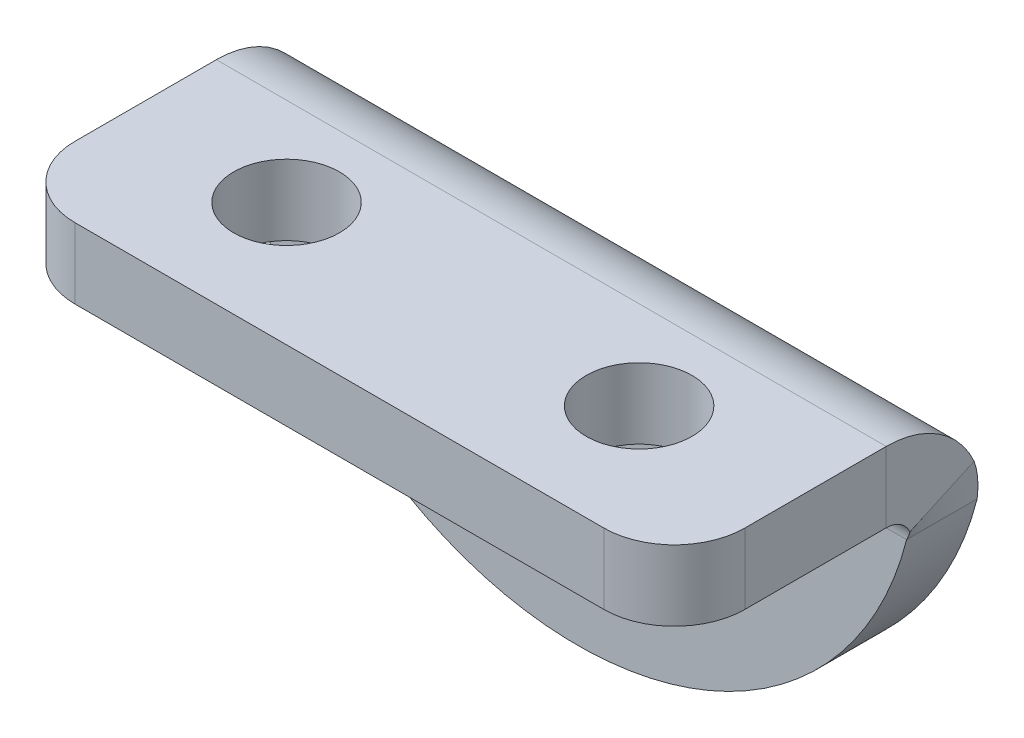
ISO-10303-21;
HEADER;
FILE_DESCRIPTION(('STEP AP214'),'2;1');
FILE_NAME('part.step','',(''),(''),'','','');
FILE_SCHEMA(('AUTOMOTIVE_DESIGN { 1 0 10303 214 1 1 1 1 }'));
ENDSEC;
DATA;
#1=APPLICATION_CONTEXT('core data for automotive mechanical design processes');
#2=APPLICATION_PROTOCOL_DEFINITION('international standard','automotive_design',2000,#1);
#3=PRODUCT_CONTEXT('',#1,'mechanical');
#4=PRODUCT('Part','Part','',(#3));
#5=PRODUCT_RELATED_PRODUCT_CATEGORY('part','',(#4));
#6=PRODUCT_DEFINITION_FORMATION('','',#4);
#7=PRODUCT_DEFINITION_CONTEXT('part definition',#1,'design');
#8=PRODUCT_DEFINITION('design','',#6,#7);
#9=PRODUCT_DEFINITION_SHAPE('','',#8);
#10=(LENGTH_UNIT() NAMED_UNIT(*) SI_UNIT(.MILLI.,.METRE.));
#11=(NAMED_UNIT(*) PLANE_ANGLE_UNIT() SI_UNIT($,.RADIAN.));
#12=(NAMED_UNIT(*) SI_UNIT($,.STERADIAN.) SOLID_ANGLE_UNIT());
#13=UNCERTAINTY_MEASURE_WITH_UNIT(LENGTH_MEASURE(1.E-05),#10,'distance_accuracy_value','');
#14=(GEOMETRIC_REPRESENTATION_CONTEXT(3) GLOBAL_UNCERTAINTY_ASSIGNED_CONTEXT((#13)) GLOBAL_UNIT_ASSIGNED_CONTEXT((#10,
#11,#12)) REPRESENTATION_CONTEXT('',''));
#15=CARTESIAN_POINT('',(0.,0.,0.));
#16=DIRECTION('',(0.,0.,1.));
#17=DIRECTION('',(1.,0.,0.));
#18=AXIS2_PLACEMENT_3D('',#15,#16,#17);
#19=CARTESIAN_POINT('',(0.,2.00000000000001,0.385980098887973));
#20=DIRECTION('',(0.,-1.,0.));
#21=DIRECTION('',(1.,0.,0.));
#22=AXIS2_PLACEMENT_3D('',#19,#20,#21);
#23=PLANE('',#22);
#24=CARTESIAN_POINT('',(-5.,2.,3.24535509888798));
#25=DIRECTION('',(0.,-1.,0.));
#26=DIRECTION('',(1.,0.,0.));
#27=AXIS2_PLACEMENT_3D('',#24,#25,#26);
#28=CIRCLE('',#27,1.5);
#29=CARTESIAN_POINT('',(-3.5,2.,3.24535509888798));
#30=VERTEX_POINT('',#29);
#31=EDGE_CURVE('E184',#30,#30,#28,.T.);
#32=ORIENTED_EDGE('',*,*,#31,.T.);
#33=EDGE_LOOP('',(#32));
#34=FACE_BOUND('',#33,.T.);
#35=CARTESIAN_POINT('',(5.,2.,3.24535509888797));
#36=DIRECTION('',(0.,-1.,0.));
#37=DIRECTION('',(-1.,0.,0.));
#38=AXIS2_PLACEMENT_3D('',#35,#36,#37);
#39=CIRCLE('',#38,1.5);
#40=CARTESIAN_POINT('',(3.5,2.,3.24535509888797));
#41=VERTEX_POINT('',#40);
#42=EDGE_CURVE('E195',#41,#41,#39,.T.);
#43=ORIENTED_EDGE('',*,*,#42,.T.);
#44=EDGE_LOOP('',(#43));
#45=FACE_BOUND('',#44,.T.);
#46=DIRECTION('',(0.,0.,1.));
#47=VECTOR('',#46,1.);
#48=CARTESIAN_POINT('',(9.5,2.00000000000002,-1.25464490111202));
#49=LINE('',#48,#47);
#50=CARTESIAN_POINT('',(9.5,2.00000000000002,0.736599999999997));
#51=VERTEX_POINT('',#50);
#52=CARTESIAN_POINT('',(9.5,2.,4.74535509888796));
#53=VERTEX_POINT('',#52);
#54=EDGE_CURVE('E62',#51,#53,#49,.T.);
#55=ORIENTED_EDGE('',*,*,#54,.F.);
#56=DIRECTION('',(-1.,0.,0.));
#57=VECTOR('',#56,1.);
#58=CARTESIAN_POINT('',(0.,2.00000000000001,0.736600000000016));
#59=LINE('',#58,#57);
#60=CARTESIAN_POINT('',(-9.5,2.00000000000001,0.73660000000001));
#61=VERTEX_POINT('',#60);
#62=EDGE_CURVE('E145',#51,#61,#59,.T.);
#63=ORIENTED_EDGE('',*,*,#62,.T.);
#64=DIRECTION('',(0.,0.,-1.));
#65=VECTOR('',#64,1.);
#66=CARTESIAN_POINT('',(-9.5,2.00000000000002,-1.25464490111202));
#67=LINE('',#66,#65);
#68=CARTESIAN_POINT('',(-9.5,2.,4.74535509888796));
#69=VERTEX_POINT('',#68);
#70=EDGE_CURVE('E177',#69,#61,#67,.T.);
#71=ORIENTED_EDGE('',*,*,#70,.F.);
#72=CARTESIAN_POINT('',(-7.5,2.,4.74535509888798));
#73=DIRECTION('',(0.,-1.,0.));
#74=DIRECTION('',(-1.,0.,0.));
#75=AXIS2_PLACEMENT_3D('',#72,#73,#74);
#76=CIRCLE('',#75,2.);
#77=CARTESIAN_POINT('',(-7.49999999999999,1.99999999999999,6.74535509888798));
#78=VERTEX_POINT('',#77);
#79=EDGE_CURVE('E180',#78,#69,#76,.T.);
#80=ORIENTED_EDGE('',*,*,#79,.F.);
#81=DIRECTION('',(-1.,0.,0.));
#82=VECTOR('',#81,1.);
#83=CARTESIAN_POINT('',(-7.49999999999999,1.99999999999999,6.74535509888798));
#84=LINE('',#83,#82);
#85=CARTESIAN_POINT('',(7.49999999999999,1.99999999999999,6.74535509888798));
#86=VERTEX_POINT('',#85);
#87=EDGE_CURVE('E202',#86,#78,#84,.T.);
#88=ORIENTED_EDGE('',*,*,#87,.F.);
#89=CARTESIAN_POINT('',(7.5,2.,4.74535509888798));
#90=DIRECTION('',(0.,-1.,0.));
#91=DIRECTION('',(-1.,0.,0.));
#92=AXIS2_PLACEMENT_3D('',#89,#90,#91);
#93=CIRCLE('',#92,2.);
#94=EDGE_CURVE('E167',#53,#86,#93,.T.);
#95=ORIENTED_EDGE('',*,*,#94,.F.);
#96=EDGE_LOOP('',(#55,#63,#71,#80,#88,#95));
#97=FACE_BOUND('',#96,.T.);
#98=ADVANCED_FACE('F58',(#34,#45,#97),#23,.F.);
#99=CARTESIAN_POINT('',(-9.5,2.00000000000002,-1.25464490111202));
#100=DIRECTION('',(-1.,0.,0.));
#101=DIRECTION('',(0.,-1.,0.));
#102=AXIS2_PLACEMENT_3D('',#99,#100,#101);
#103=PLANE('',#102);
#104=DIRECTION('',(0.,1.,0.));
#105=VECTOR('',#104,1.);
#106=CARTESIAN_POINT('',(-9.5,2.,0.736600000000016));
#107=LINE('',#106,#105);
#108=CARTESIAN_POINT('',(-9.5,0.,0.736599999999999));
#109=VERTEX_POINT('',#108);
#110=EDGE_CURVE('E12',#109,#61,#107,.T.);
#111=ORIENTED_EDGE('',*,*,#110,.F.);
#112=DIRECTION('',(0.,0.,-1.));
#113=VECTOR('',#112,1.);
#114=CARTESIAN_POINT('',(-9.5,0.,-1.25464490111203));
#115=LINE('',#114,#113);
#116=CARTESIAN_POINT('',(-9.5,0.,4.74535509888795));
#117=VERTEX_POINT('',#116);
#118=EDGE_CURVE('E168',#117,#109,#115,.T.);
#119=ORIENTED_EDGE('',*,*,#118,.F.);
#120=DIRECTION('',(0.,-1.,0.));
#121=VECTOR('',#120,1.);
#122=CARTESIAN_POINT('',(-9.5,2.,4.74535509888796));
#123=LINE('',#122,#121);
#124=EDGE_CURVE('E83',#69,#117,#123,.T.);
#125=ORIENTED_EDGE('',*,*,#124,.F.);
#126=ORIENTED_EDGE('',*,*,#70,.T.);
#127=EDGE_LOOP('',(#111,#119,#125,#126));
#128=FACE_BOUND('',#127,.T.);
#129=ADVANCED_FACE('F60',(#128),#103,.T.);
#130=CARTESIAN_POINT('',(-7.5,2.,4.74535509888798));
#131=DIRECTION('',(0.,-1.,0.));
#132=DIRECTION('',(1.,0.,0.));
#133=AXIS2_PLACEMENT_3D('',#130,#131,#132);
#134=CYLINDRICAL_SURFACE('',#133,2.);
#135=CARTESIAN_POINT('',(-7.5,0.,4.74535509888797));
#136=DIRECTION('',(0.,-1.,0.));
#137=DIRECTION('',(-1.,0.,0.));
#138=AXIS2_PLACEMENT_3D('',#135,#136,#137);
#139=CIRCLE('',#138,2.);
#140=CARTESIAN_POINT('',(-7.49999999999999,0.,6.74535509888797));
#141=VERTEX_POINT('',#140);
#142=EDGE_CURVE('E182',#141,#117,#139,.T.);
#143=ORIENTED_EDGE('',*,*,#142,.F.);
#144=DIRECTION('',(0.,-1.,0.));
#145=VECTOR('',#144,1.);
#146=CARTESIAN_POINT('',(-7.49999999999999,1.99999999999999,6.74535509888798));
#147=LINE('',#146,#145);
#148=EDGE_CURVE('E210',#78,#141,#147,.T.);
#149=ORIENTED_EDGE('',*,*,#148,.F.);
#150=ORIENTED_EDGE('',*,*,#79,.T.);
#151=ORIENTED_EDGE('',*,*,#124,.T.);
#152=EDGE_LOOP('',(#143,#149,#150,#151));
#153=FACE_BOUND('',#152,.T.);
#154=ADVANCED_FACE('F222',(#153),#134,.T.);
#155=CARTESIAN_POINT('',(-7.49999999999999,1.99999999999999,6.74535509888798));
#156=DIRECTION('',(0.,0.,1.));
#157=DIRECTION('',(-1.,0.,0.));
#158=AXIS2_PLACEMENT_3D('',#155,#156,#157);
#159=PLANE('',#158);
#160=DIRECTION('',(-1.,0.,0.));
#161=VECTOR('',#160,1.);
#162=CARTESIAN_POINT('',(-7.49999999999999,0.,6.74535509888797));
#163=LINE('',#162,#161);
#164=CARTESIAN_POINT('',(7.49999999999999,0.,6.74535509888797));
#165=VERTEX_POINT('',#164);
#166=EDGE_CURVE('E187',#165,#141,#163,.T.);
#167=ORIENTED_EDGE('',*,*,#166,.F.);
#168=DIRECTION('',(0.,-1.,0.));
#169=VECTOR('',#168,1.);
#170=CARTESIAN_POINT('',(7.49999999999999,1.99999999999999,6.74535509888798));
#171=LINE('',#170,#169);
#172=EDGE_CURVE('E212',#86,#165,#171,.T.);
#173=ORIENTED_EDGE('',*,*,#172,.F.);
#174=ORIENTED_EDGE('',*,*,#87,.T.);
#175=ORIENTED_EDGE('',*,*,#148,.T.);
#176=EDGE_LOOP('',(#167,#173,#174,#175));
#177=FACE_BOUND('',#176,.T.);
#178=ADVANCED_FACE('F220',(#177),#159,.T.);
#179=CARTESIAN_POINT('',(7.5,2.,4.74535509888798));
#180=DIRECTION('',(0.,-1.,0.));
#181=DIRECTION('',(1.,0.,0.));
#182=AXIS2_PLACEMENT_3D('',#179,#180,#181);
#183=CYLINDRICAL_SURFACE('',#182,2.);
#184=CARTESIAN_POINT('',(7.5,0.,4.74535509888797));
#185=DIRECTION('',(0.,-1.,0.));
#186=DIRECTION('',(-1.,0.,0.));
#187=AXIS2_PLACEMENT_3D('',#184,#185,#186);
#188=CIRCLE('',#187,2.);
#189=CARTESIAN_POINT('',(9.5,0.,4.74535509888796));
#190=VERTEX_POINT('',#189);
#191=EDGE_CURVE('E183',#190,#165,#188,.T.);
#192=ORIENTED_EDGE('',*,*,#191,.F.);
#193=DIRECTION('',(0.,-1.,0.));
#194=VECTOR('',#193,1.);
#195=CARTESIAN_POINT('',(9.5,2.,4.74535509888796));
#196=LINE('',#195,#194);
#197=EDGE_CURVE('E179',#53,#190,#196,.T.);
#198=ORIENTED_EDGE('',*,*,#197,.F.);
#199=ORIENTED_EDGE('',*,*,#94,.T.);
#200=ORIENTED_EDGE('',*,*,#172,.T.);
#201=EDGE_LOOP('',(#192,#198,#199,#200));
#202=FACE_BOUND('',#201,.T.);
#203=ADVANCED_FACE('F215',(#202),#183,.T.);
#204=CARTESIAN_POINT('',(9.5,2.00000000000002,-1.25464490111202));
#205=DIRECTION('',(1.,0.,0.));
#206=DIRECTION('',(0.,1.,0.));
#207=AXIS2_PLACEMENT_3D('',#204,#205,#206);
#208=PLANE('',#207);
#209=DIRECTION('',(0.,-1.,0.));
#210=VECTOR('',#209,1.);
#211=CARTESIAN_POINT('',(9.5,2.,0.736600000000016));
#212=LINE('',#211,#210);
#213=CARTESIAN_POINT('',(9.5,0.,0.736599999999999));
#214=VERTEX_POINT('',#213);
#215=EDGE_CURVE('E153',#51,#214,#212,.T.);
#216=ORIENTED_EDGE('',*,*,#215,.F.);
#217=ORIENTED_EDGE('',*,*,#54,.T.);
#218=ORIENTED_EDGE('',*,*,#197,.T.);
#219=DIRECTION('',(0.,0.,1.));
#220=VECTOR('',#219,1.);
#221=CARTESIAN_POINT('',(9.5,0.,-1.25464490111203));
#222=LINE('',#221,#220);
#223=EDGE_CURVE('E171',#214,#190,#222,.T.);
#224=ORIENTED_EDGE('',*,*,#223,.F.);
#225=EDGE_LOOP('',(#216,#217,#218,#224));
#226=FACE_BOUND('',#225,.T.);
#227=ADVANCED_FACE('F170',(#226),#208,.T.);
#228=CARTESIAN_POINT('',(0.,0.,0.385980098887966));
#229=DIRECTION('',(0.,-1.,0.));
#230=DIRECTION('',(1.,0.,0.));
#231=AXIS2_PLACEMENT_3D('',#228,#229,#230);
#232=PLANE('',#231);
#233=DIRECTION('',(-1.,0.,0.));
#234=VECTOR('',#233,1.);
#235=CARTESIAN_POINT('',(0.,0.,0.736599999999996));
#236=LINE('',#235,#234);
#237=EDGE_CURVE('E67',#214,#109,#236,.T.);
#238=ORIENTED_EDGE('',*,*,#237,.F.);
#239=ORIENTED_EDGE('',*,*,#223,.T.);
#240=ORIENTED_EDGE('',*,*,#191,.T.);
#241=ORIENTED_EDGE('',*,*,#166,.T.);
#242=ORIENTED_EDGE('',*,*,#142,.T.);
#243=ORIENTED_EDGE('',*,*,#118,.T.);
#244=EDGE_LOOP('',(#238,#239,#240,#241,#242,#243));
#245=FACE_BOUND('',#244,.T.);
#246=CARTESIAN_POINT('',(5.,0.,3.24535509888797));
#247=DIRECTION('',(0.,-1.,0.));
#248=DIRECTION('',(-1.,0.,0.));
#249=AXIS2_PLACEMENT_3D('',#246,#247,#248);
#250=CIRCLE('',#249,1.5);
#251=CARTESIAN_POINT('',(3.5,0.,3.24535509888797));
#252=VERTEX_POINT('',#251);
#253=EDGE_CURVE('E198',#252,#252,#250,.T.);
#254=ORIENTED_EDGE('',*,*,#253,.F.);
#255=EDGE_LOOP('',(#254));
#256=FACE_BOUND('',#255,.T.);
#257=CARTESIAN_POINT('',(-5.,0.,3.24535509888797));
#258=DIRECTION('',(0.,-1.,0.));
#259=DIRECTION('',(1.,0.,0.));
#260=AXIS2_PLACEMENT_3D('',#257,#258,#259);
#261=CIRCLE('',#260,1.5);
#262=CARTESIAN_POINT('',(-3.5,0.,3.24535509888797));
#263=VERTEX_POINT('',#262);
#264=EDGE_CURVE('E190',#263,#263,#261,.T.);
#265=ORIENTED_EDGE('',*,*,#264,.F.);
#266=EDGE_LOOP('',(#265));
#267=FACE_BOUND('',#266,.T.);
#268=ADVANCED_FACE('F217',(#245,#256,#267),#232,.T.);
#269=CARTESIAN_POINT('',(-5.,2.,3.24535509888798));
#270=DIRECTION('',(0.,-1.,0.));
#271=DIRECTION('',(1.,0.,0.));
#272=AXIS2_PLACEMENT_3D('',#269,#270,#271);
#273=CYLINDRICAL_SURFACE('',#272,1.5);
#274=ORIENTED_EDGE('',*,*,#31,.F.);
#275=EDGE_LOOP('',(#274));
#276=FACE_BOUND('',#275,.T.);
#277=ORIENTED_EDGE('',*,*,#264,.T.);
#278=EDGE_LOOP('',(#277));
#279=FACE_BOUND('',#278,.T.);
#280=ADVANCED_FACE('F240',(#276,#279),#273,.F.);
#281=CARTESIAN_POINT('',(5.,2.,3.24535509888797));
#282=DIRECTION('',(0.,-1.,0.));
#283=DIRECTION('',(1.,0.,0.));
#284=AXIS2_PLACEMENT_3D('',#281,#282,#283);
#285=CYLINDRICAL_SURFACE('',#284,1.5);
#286=ORIENTED_EDGE('',*,*,#42,.F.);
#287=EDGE_LOOP('',(#286));
#288=FACE_BOUND('',#287,.T.);
#289=ORIENTED_EDGE('',*,*,#253,.T.);
#290=EDGE_LOOP('',(#289));
#291=FACE_BOUND('',#290,.T.);
#292=ADVANCED_FACE('F244',(#288,#291),#285,.F.);
#293=CARTESIAN_POINT('',(0.,-4.,-2.));
#294=DIRECTION('',(0.,0.,1.));
#295=DIRECTION('',(1.,0.,0.));
#296=AXIS2_PLACEMENT_3D('',#293,#294,#295);
#297=CYLINDRICAL_SURFACE('',#296,1.5);
#298=CARTESIAN_POINT('',(0.,-4.,-2.));
#299=DIRECTION('',(0.,0.,1.));
#300=DIRECTION('',(1.,0.,0.));
#301=AXIS2_PLACEMENT_3D('',#298,#299,#300);
#302=CIRCLE('',#301,1.5);
#303=CARTESIAN_POINT('',(1.5,-4.,-2.));
#304=VERTEX_POINT('',#303);
#305=EDGE_CURVE('E312',#304,#304,#302,.T.);
#306=ORIENTED_EDGE('',*,*,#305,.F.);
#307=EDGE_LOOP('',(#306));
#308=FACE_BOUND('',#307,.T.);
#309=CARTESIAN_POINT('',(0.,-4.,0.));
#310=DIRECTION('',(0.,0.,1.));
#311=DIRECTION('',(1.,0.,0.));
#312=AXIS2_PLACEMENT_3D('',#309,#310,#311);
#313=CIRCLE('',#312,1.5);
#314=CARTESIAN_POINT('',(1.5,-4.,0.));
#315=VERTEX_POINT('',#314);
#316=EDGE_CURVE('E298',#315,#315,#313,.T.);
#317=ORIENTED_EDGE('',*,*,#316,.T.);
#318=EDGE_LOOP('',(#317));
#319=FACE_BOUND('',#318,.T.);
#320=ADVANCED_FACE('F249',(#308,#319),#297,.F.);
#321=CARTESIAN_POINT('',(0.,1.640625,-2.));
#322=DIRECTION('',(0.,0.,1.));
#323=DIRECTION('',(1.,0.,0.));
#324=AXIS2_PLACEMENT_3D('',#321,#322,#323);
#325=PLANE('',#324);
#326=DIRECTION('',(-1.,0.,0.));
#327=VECTOR('',#326,1.);
#328=CARTESIAN_POINT('',(0.,-0.736599999999982,-2.));
#329=LINE('',#328,#327);
#330=CARTESIAN_POINT('',(9.34293592453679,-0.736599999999991,-2.));
#331=VERTEX_POINT('',#330);
#332=CARTESIAN_POINT('',(-9.34293592453679,-0.736599999999983,-2.));
#333=VERTEX_POINT('',#332);
#334=EDGE_CURVE('E316',#331,#333,#329,.T.);
#335=ORIENTED_EDGE('',*,*,#334,.F.);
#336=CARTESIAN_POINT('',(0.,1.640625,-2.));
#337=DIRECTION('',(0.,0.,1.));
#338=DIRECTION('',(1.,0.,0.));
#339=AXIS2_PLACEMENT_3D('',#336,#337,#338);
#340=CIRCLE('',#339,9.640625);
#341=EDGE_CURVE('E307',#333,#331,#340,.T.);
#342=ORIENTED_EDGE('',*,*,#341,.F.);
#343=EDGE_LOOP('',(#335,#342));
#344=FACE_BOUND('',#343,.T.);
#345=ORIENTED_EDGE('',*,*,#305,.T.);
#346=EDGE_LOOP('',(#345));
#347=FACE_BOUND('',#346,.T.);
#348=ADVANCED_FACE('F262',(#344,#347),#325,.F.);
#349=CARTESIAN_POINT('',(0.,1.640625,-2.));
#350=DIRECTION('',(0.,0.,1.));
#351=DIRECTION('',(1.,0.,0.));
#352=AXIS2_PLACEMENT_3D('',#349,#350,#351);
#353=CYLINDRICAL_SURFACE('',#352,9.640625);
#354=CARTESIAN_POINT('',(0.,1.640625,0.));
#355=DIRECTION('',(0.,0.,1.));
#356=DIRECTION('',(1.,0.,0.));
#357=AXIS2_PLACEMENT_3D('',#354,#355,#356);
#358=CIRCLE('',#357,9.640625);
#359=CARTESIAN_POINT('',(-9.34293592453679,-0.736599999999983,0.));
#360=VERTEX_POINT('',#359);
#361=CARTESIAN_POINT('',(9.34293592453679,-0.736599999999995,0.));
#362=VERTEX_POINT('',#361);
#363=EDGE_CURVE('E289',#360,#362,#358,.T.);
#364=ORIENTED_EDGE('',*,*,#363,.F.);
#365=CARTESIAN_POINT('',(-9.34293592453679,-0.736599999999976,-2.));
#366=CARTESIAN_POINT('',(-9.34293592453679,-0.736599999999981,0.));
#367=B_SPLINE_CURVE_WITH_KNOTS('',1,(#365,#366),.UNSPECIFIED.,.F.,.F.,(2,2),(0.,1.),.UNSPECIFIED.);
#368=EDGE_CURVE('E310',#360,#333,#367,.F.);
#369=ORIENTED_EDGE('',*,*,#368,.T.);
#370=ORIENTED_EDGE('',*,*,#341,.T.);
#371=CARTESIAN_POINT('',(9.34293592453679,-0.736599999999984,0.));
#372=CARTESIAN_POINT('',(9.34293592453679,-0.736599999999991,-2.));
#373=B_SPLINE_CURVE_WITH_KNOTS('',1,(#371,#372),.UNSPECIFIED.,.F.,.F.,(2,2),(0.,1.),.UNSPECIFIED.);
#374=EDGE_CURVE('E294',#331,#362,#373,.F.);
#375=ORIENTED_EDGE('',*,*,#374,.T.);
#376=EDGE_LOOP('',(#364,#369,#370,#375));
#377=FACE_BOUND('',#376,.T.);
#378=ADVANCED_FACE('F257',(#377),#353,.T.);
#379=CARTESIAN_POINT('',(0.,1.640625,0.));
#380=DIRECTION('',(0.,0.,1.));
#381=DIRECTION('',(1.,0.,0.));
#382=AXIS2_PLACEMENT_3D('',#379,#380,#381);
#383=PLANE('',#382);
#384=ORIENTED_EDGE('',*,*,#316,.F.);
#385=EDGE_LOOP('',(#384));
#386=FACE_BOUND('',#385,.T.);
#387=ORIENTED_EDGE('',*,*,#363,.T.);
#388=DIRECTION('',(-1.,0.,0.));
#389=VECTOR('',#388,1.);
#390=CARTESIAN_POINT('',(0.,-0.736599999999996,0.));
#391=LINE('',#390,#389);
#392=EDGE_CURVE('E285',#362,#360,#391,.T.);
#393=ORIENTED_EDGE('',*,*,#392,.T.);
#394=EDGE_LOOP('',(#387,#393));
#395=FACE_BOUND('',#394,.T.);
#396=ADVANCED_FACE('F254',(#386,#395),#383,.T.);
#397=CARTESIAN_POINT('',(9.5,-0.736599999999981,0.7366));
#398=DIRECTION('',(1.,0.,0.));
#399=DIRECTION('',(0.,0.,-1.));
#400=AXIS2_PLACEMENT_3D('',#397,#398,#399);
#401=PLANE('',#400);
#402=ORIENTED_EDGE('',*,*,#215,.T.);
#403=CARTESIAN_POINT('',(9.5,-0.736599999999981,0.7366));
#404=DIRECTION('',(1.,0.,0.));
#405=DIRECTION('',(0.,1.,0.));
#406=AXIS2_PLACEMENT_3D('',#403,#404,#405);
#407=CIRCLE('',#406,0.7366);
#408=CARTESIAN_POINT('',(9.5,-0.433446871666276,0.065274638657612));
#409=VERTEX_POINT('',#408);
#410=EDGE_CURVE('E366',#214,#409,#407,.F.);
#411=ORIENTED_EDGE('',*,*,#410,.T.);
#412=CARTESIAN_POINT('',(9.5,0.389667785769794,-1.75749310867442));
#413=CARTESIAN_POINT('',(9.5,-0.433446871666276,0.0652746386576111));
#414=B_SPLINE_CURVE_WITH_KNOTS('',1,(#412,#413),.UNSPECIFIED.,.F.,.F.,(2,2),(0.,1.),.UNSPECIFIED.);
#415=CARTESIAN_POINT('',(9.5,0.389667785769798,-1.75749310867442));
#416=VERTEX_POINT('',#415);
#417=EDGE_CURVE('E159',#409,#416,#414,.F.);
#418=ORIENTED_EDGE('',*,*,#417,.T.);
#419=CARTESIAN_POINT('',(9.5,-0.736599999999981,0.7366));
#420=DIRECTION('',(-1.,0.,0.));
#421=DIRECTION('',(0.,0.,-1.));
#422=AXIS2_PLACEMENT_3D('',#419,#420,#421);
#423=CIRCLE('',#422,2.7366);
#424=EDGE_CURVE('E149',#51,#416,#423,.T.);
#425=ORIENTED_EDGE('',*,*,#424,.F.);
#426=EDGE_LOOP('',(#402,#411,#418,#425));
#427=FACE_BOUND('',#426,.T.);
#428=ADVANCED_FACE('F156',(#427),#401,.T.);
#429=CARTESIAN_POINT('',(9.5,0.389667785769794,-1.75749310867442));
#430=CARTESIAN_POINT('',(9.44760522542867,0.0367645063639416,-1.91685508024836));
#431=CARTESIAN_POINT('',(9.39533069910812,-0.349383054865437,-2.));
#432=CARTESIAN_POINT('',(9.34293592453679,-0.736599999999991,-2.));
#433=CARTESIAN_POINT('',(9.5,-0.433446871666276,0.0652746386576111));
#434=CARTESIAN_POINT('',(9.44761140645582,-0.528425271652341,0.0223848556434095));
#435=CARTESIAN_POINT('',(9.39532451808097,-0.632386613379463,0.));
#436=CARTESIAN_POINT('',(9.34293592453679,-0.736599999999984,0.));
#437=B_SPLINE_SURFACE_WITH_KNOTS('',1,3,((#429,#430,#431,#432),(#433,#434,#435,#436)),
.UNSPECIFIED.,.F.,.F.,.F.,(2,2),(4,4),(0.,1.),(0.,1.),.UNSPECIFIED.);
#438=CARTESIAN_POINT('',(9.5,-0.433446871666276,0.0652746386576111));
#439=CARTESIAN_POINT('',(9.44761140645582,-0.528425271652341,0.0223848556434095));
#440=CARTESIAN_POINT('',(9.39532451808097,-0.632386613379463,0.));
#441=CARTESIAN_POINT('',(9.34293592453679,-0.736599999999984,0.));
#442=B_SPLINE_CURVE_WITH_KNOTS('',3,(#438,#439,#440,#441),.UNSPECIFIED.,.F.,.F.,(4,4),(0.,1.),.UNSPECIFIED.);
#443=EDGE_CURVE('E373',#409,#362,#442,.T.);
#444=CARTESIAN_POINT('',(9.34293592453679,-0.736599999999991,-2.));
#445=CARTESIAN_POINT('',(9.39533069910812,-0.349383054865437,-2.));
#446=CARTESIAN_POINT('',(9.44760522542867,0.0367645063639416,-1.91685508024836));
#447=CARTESIAN_POINT('',(9.5,0.389667785769794,-1.75749310867442));
#448=B_SPLINE_CURVE_WITH_KNOTS('',3,(#444,#445,#446,#447),.UNSPECIFIED.,.F.,.F.,(4,4),(0.,1.),.UNSPECIFIED.);
#449=EDGE_CURVE('E161',#416,#331,#448,.F.);
#450=ORIENTED_EDGE('',*,*,#417,.F.);
#451=ORIENTED_EDGE('',*,*,#443,.T.);
#452=ORIENTED_EDGE('',*,*,#374,.F.);
#453=ORIENTED_EDGE('',*,*,#449,.F.);
#454=EDGE_LOOP('',(#450,#451,#452,#453));
#455=FACE_BOUND('',#454,.T.);
#456=ADVANCED_FACE('F381',(#455),#437,.T.);
#457=CARTESIAN_POINT('',(-9.34293592453679,-0.736599999999976,-2.));
#458=CARTESIAN_POINT('',(-9.39533069910812,-0.349383054865424,-2.));
#459=CARTESIAN_POINT('',(-9.44760522542867,0.0367645063639514,-1.91685508024835));
#460=CARTESIAN_POINT('',(-9.5,0.389667785769801,-1.75749310867442));
#461=CARTESIAN_POINT('',(-9.34293592453679,-0.736599999999981,0.));
#462=CARTESIAN_POINT('',(-9.39532451808097,-0.632386613379463,0.));
#463=CARTESIAN_POINT('',(-9.44761140645582,-0.528425271652339,0.0223848556434118));
#464=CARTESIAN_POINT('',(-9.5,-0.433446871666276,0.0652746386576126));
#465=B_SPLINE_SURFACE_WITH_KNOTS('',1,3,((#457,#458,#459,#460),(#461,#462,#463,#464)),
.UNSPECIFIED.,.F.,.F.,.F.,(2,2),(4,4),(0.,1.),(0.,1.),.UNSPECIFIED.);
#466=CARTESIAN_POINT('',(-9.34293592453679,-0.736599999999981,0.));
#467=CARTESIAN_POINT('',(-9.39532451808097,-0.632386613379463,0.));
#468=CARTESIAN_POINT('',(-9.44761140645582,-0.528425271652339,0.0223848556434118));
#469=CARTESIAN_POINT('',(-9.5,-0.433446871666276,0.0652746386576126));
#470=B_SPLINE_CURVE_WITH_KNOTS('',3,(#466,#467,#468,#469),.UNSPECIFIED.,.F.,.F.,(4,4),(0.,1.),.UNSPECIFIED.);
#471=CARTESIAN_POINT('',(-9.5,-0.433446871666276,0.0652746386576127));
#472=VERTEX_POINT('',#471);
#473=EDGE_CURVE('E336',#360,#472,#470,.T.);
#474=CARTESIAN_POINT('',(-9.5,-0.433446871666276,0.0652746386576126));
#475=CARTESIAN_POINT('',(-9.5,0.389667785769801,-1.75749310867442));
#476=B_SPLINE_CURVE_WITH_KNOTS('',1,(#474,#475),.UNSPECIFIED.,.F.,.F.,(2,2),(0.,1.),.UNSPECIFIED.);
#477=CARTESIAN_POINT('',(-9.5,0.389667785769801,-1.75749310867442));
#478=VERTEX_POINT('',#477);
#479=EDGE_CURVE('E320',#472,#478,#476,.T.);
#480=CARTESIAN_POINT('',(-9.5,0.389667785769801,-1.75749310867442));
#481=CARTESIAN_POINT('',(-9.44760522542867,0.0367645063639514,-1.91685508024835));
#482=CARTESIAN_POINT('',(-9.39533069910812,-0.349383054865424,-2.));
#483=CARTESIAN_POINT('',(-9.34293592453679,-0.736599999999976,-2.));
#484=B_SPLINE_CURVE_WITH_KNOTS('',3,(#480,#481,#482,#483),.UNSPECIFIED.,.F.,.F.,(4,4),(0.,1.),.UNSPECIFIED.);
#485=EDGE_CURVE('E324',#333,#478,#484,.F.);
#486=ORIENTED_EDGE('',*,*,#368,.F.);
#487=ORIENTED_EDGE('',*,*,#473,.T.);
#488=ORIENTED_EDGE('',*,*,#479,.T.);
#489=ORIENTED_EDGE('',*,*,#485,.F.);
#490=EDGE_LOOP('',(#486,#487,#488,#489));
#491=FACE_BOUND('',#490,.T.);
#492=ADVANCED_FACE('F353',(#491),#465,.T.);
#493=CARTESIAN_POINT('',(-9.5,-0.736599999999983,0.7366));
#494=DIRECTION('',(-1.,0.,0.));
#495=DIRECTION('',(0.,0.,1.));
#496=AXIS2_PLACEMENT_3D('',#493,#494,#495);
#497=PLANE('',#496);
#498=CARTESIAN_POINT('',(-9.5,-0.736599999999983,0.7366));
#499=DIRECTION('',(1.,0.,0.));
#500=DIRECTION('',(0.,1.,0.));
#501=AXIS2_PLACEMENT_3D('',#498,#499,#500);
#502=CIRCLE('',#501,0.7366);
#503=EDGE_CURVE('E162',#472,#109,#502,.T.);
#504=ORIENTED_EDGE('',*,*,#503,.T.);
#505=ORIENTED_EDGE('',*,*,#110,.T.);
#506=CARTESIAN_POINT('',(-9.5,-0.736599999999983,0.7366));
#507=DIRECTION('',(1.,0.,0.));
#508=DIRECTION('',(0.,0.,1.));
#509=AXIS2_PLACEMENT_3D('',#506,#507,#508);
#510=CIRCLE('',#509,2.7366);
#511=EDGE_CURVE('E75',#478,#61,#510,.T.);
#512=ORIENTED_EDGE('',*,*,#511,.F.);
#513=ORIENTED_EDGE('',*,*,#479,.F.);
#514=EDGE_LOOP('',(#504,#505,#512,#513));
#515=FACE_BOUND('',#514,.T.);
#516=ADVANCED_FACE('F445',(#515),#497,.T.);
#517=CARTESIAN_POINT('',(-19.2987340984978,-0.736599999999984,0.7366));
#518=DIRECTION('',(1.,0.,0.));
#519=DIRECTION('',(0.,1.,0.));
#520=AXIS2_PLACEMENT_3D('',#517,#518,#519);
#521=CYLINDRICAL_SURFACE('',#520,2.7366);
#522=ORIENTED_EDGE('',*,*,#485,.T.);
#523=ORIENTED_EDGE('',*,*,#511,.T.);
#524=ORIENTED_EDGE('',*,*,#62,.F.);
#525=ORIENTED_EDGE('',*,*,#424,.T.);
#526=ORIENTED_EDGE('',*,*,#449,.T.);
#527=ORIENTED_EDGE('',*,*,#334,.T.);
#528=EDGE_LOOP('',(#522,#523,#524,#525,#526,#527));
#529=FACE_BOUND('',#528,.T.);
#530=ADVANCED_FACE('F147',(#529),#521,.T.);
#531=CARTESIAN_POINT('',(-19.2987340984978,-0.736599999999984,0.7366));
#532=DIRECTION('',(1.,0.,0.));
#533=DIRECTION('',(0.,1.,0.));
#534=AXIS2_PLACEMENT_3D('',#531,#532,#533);
#535=CYLINDRICAL_SURFACE('',#534,0.7366);
#536=ORIENTED_EDGE('',*,*,#473,.F.);
#537=ORIENTED_EDGE('',*,*,#392,.F.);
#538=ORIENTED_EDGE('',*,*,#443,.F.);
#539=ORIENTED_EDGE('',*,*,#410,.F.);
#540=ORIENTED_EDGE('',*,*,#237,.T.);
#541=ORIENTED_EDGE('',*,*,#503,.F.);
#542=EDGE_LOOP('',(#536,#537,#538,#539,#540,#541));
#543=FACE_BOUND('',#542,.T.);
#544=ADVANCED_FACE('F342',(#543),#535,.F.);
#545=CLOSED_SHELL('',(#98,#129,#154,#178,#203,#227,#268,#280,#292,#320,#348,#378,#396,#428,#456,
#492,#516,#530,#544));
#546=MANIFOLD_SOLID_BREP('B2',#545);
#547=ADVANCED_BREP_SHAPE_REPRESENTATION('',(#18,#546),#14);
#548=SHAPE_DEFINITION_REPRESENTATION(#9,#547);
ENDSEC;
END-ISO-10303-21;
